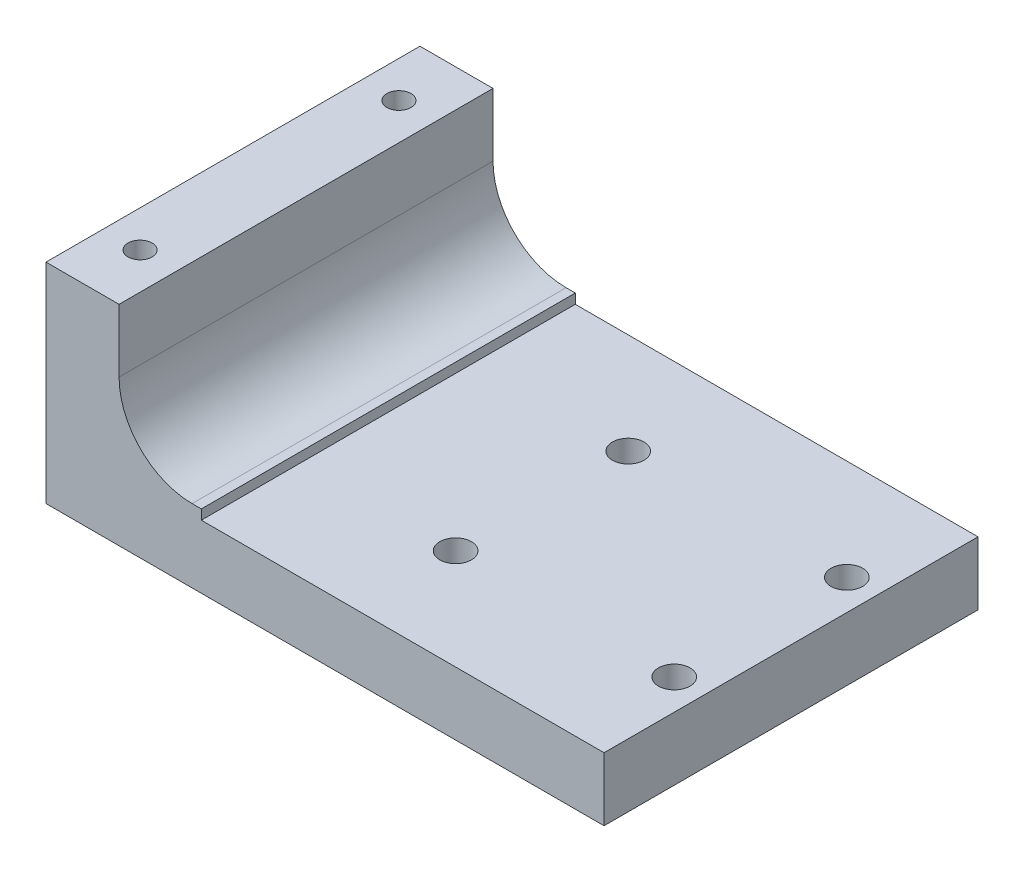
ISO-10303-21;
HEADER;
FILE_DESCRIPTION(('STEP AP214'),'2;1');
FILE_NAME('part.step','',(''),(''),'','','');
FILE_SCHEMA(('AUTOMOTIVE_DESIGN { 1 0 10303 214 1 1 1 1 }'));
ENDSEC;
DATA;
#1=APPLICATION_CONTEXT('core data for automotive mechanical design processes');
#2=APPLICATION_PROTOCOL_DEFINITION('international standard','automotive_design',2000,#1);
#3=PRODUCT_CONTEXT('',#1,'mechanical');
#4=PRODUCT('Part','Part','',(#3));
#5=PRODUCT_RELATED_PRODUCT_CATEGORY('part','',(#4));
#6=PRODUCT_DEFINITION_FORMATION('','',#4);
#7=PRODUCT_DEFINITION_CONTEXT('part definition',#1,'design');
#8=PRODUCT_DEFINITION('design','',#6,#7);
#9=PRODUCT_DEFINITION_SHAPE('','',#8);
#10=(LENGTH_UNIT() NAMED_UNIT(*) SI_UNIT(.MILLI.,.METRE.));
#11=(NAMED_UNIT(*) PLANE_ANGLE_UNIT() SI_UNIT($,.RADIAN.));
#12=(NAMED_UNIT(*) SI_UNIT($,.STERADIAN.) SOLID_ANGLE_UNIT());
#13=UNCERTAINTY_MEASURE_WITH_UNIT(LENGTH_MEASURE(1.E-05),#10,'distance_accuracy_value','');
#14=(GEOMETRIC_REPRESENTATION_CONTEXT(3) GLOBAL_UNCERTAINTY_ASSIGNED_CONTEXT((#13)) GLOBAL_UNIT_ASSIGNED_CONTEXT((#10,
#11,#12)) REPRESENTATION_CONTEXT('',''));
#15=CARTESIAN_POINT('',(0.,0.,0.));
#16=DIRECTION('',(0.,0.,1.));
#17=DIRECTION('',(1.,0.,0.));
#18=AXIS2_PLACEMENT_3D('',#15,#16,#17);
#19=CARTESIAN_POINT('',(0.,0.,32.5));
#20=DIRECTION('',(1.,0.,0.));
#21=DIRECTION('',(0.,0.,-1.));
#22=AXIS2_PLACEMENT_3D('',#19,#20,#21);
#23=PLANE('',#22);
#24=DIRECTION('',(0.,-1.,0.));
#25=VECTOR('',#24,1.);
#26=CARTESIAN_POINT('',(0.,0.,-32.5));
#27=LINE('',#26,#25);
#28=CARTESIAN_POINT('',(0.,36.35,-32.5));
#29=VERTEX_POINT('',#28);
#30=CARTESIAN_POINT('',(0.,0.,-32.5));
#31=VERTEX_POINT('',#30);
#32=EDGE_CURVE('E135',#29,#31,#27,.T.);
#33=ORIENTED_EDGE('',*,*,#32,.T.);
#34=DIRECTION('',(0.,0.,-1.));
#35=VECTOR('',#34,1.);
#36=CARTESIAN_POINT('',(0.,0.,32.5));
#37=LINE('',#36,#35);
#38=CARTESIAN_POINT('',(0.,0.,32.5));
#39=VERTEX_POINT('',#38);
#40=EDGE_CURVE('E11',#39,#31,#37,.T.);
#41=ORIENTED_EDGE('',*,*,#40,.F.);
#42=DIRECTION('',(0.,-1.,0.));
#43=VECTOR('',#42,1.);
#44=CARTESIAN_POINT('',(0.,0.,32.5));
#45=LINE('',#44,#43);
#46=CARTESIAN_POINT('',(0.,36.35,32.5));
#47=VERTEX_POINT('',#46);
#48=EDGE_CURVE('E150',#47,#39,#45,.T.);
#49=ORIENTED_EDGE('',*,*,#48,.F.);
#50=DIRECTION('',(0.,0.,-1.));
#51=VECTOR('',#50,1.);
#52=CARTESIAN_POINT('',(0.,36.35,32.5));
#53=LINE('',#52,#51);
#54=EDGE_CURVE('E131',#47,#29,#53,.T.);
#55=ORIENTED_EDGE('',*,*,#54,.T.);
#56=EDGE_LOOP('',(#33,#41,#49,#55));
#57=FACE_BOUND('',#56,.T.);
#58=ADVANCED_FACE('F37',(#57),#23,.F.);
#59=CARTESIAN_POINT('',(0.,0.,32.5));
#60=DIRECTION('',(0.,1.,0.));
#61=DIRECTION('',(0.,0.,1.));
#62=AXIS2_PLACEMENT_3D('',#59,#60,#61);
#63=PLANE('',#62);
#64=CARTESIAN_POINT('',(53.7000000000001,0.,15.));
#65=DIRECTION('',(0.,-1.,0.));
#66=DIRECTION('',(0.,0.,-1.));
#67=AXIS2_PLACEMENT_3D('',#64,#65,#66);
#68=CIRCLE('',#67,2.74999999999999);
#69=CARTESIAN_POINT('',(53.7000000000001,0.,12.25));
#70=VERTEX_POINT('',#69);
#71=EDGE_CURVE('E227',#70,#70,#68,.T.);
#72=ORIENTED_EDGE('',*,*,#71,.F.);
#73=EDGE_LOOP('',(#72));
#74=FACE_BOUND('',#73,.T.);
#75=CARTESIAN_POINT('',(91.7000000000001,0.,15.));
#76=DIRECTION('',(0.,-1.,0.));
#77=DIRECTION('',(0.,0.,-1.));
#78=AXIS2_PLACEMENT_3D('',#75,#76,#77);
#79=CIRCLE('',#78,2.74999999999999);
#80=CARTESIAN_POINT('',(91.7000000000001,0.,12.25));
#81=VERTEX_POINT('',#80);
#82=EDGE_CURVE('E230',#81,#81,#79,.T.);
#83=ORIENTED_EDGE('',*,*,#82,.F.);
#84=EDGE_LOOP('',(#83));
#85=FACE_BOUND('',#84,.T.);
#86=CARTESIAN_POINT('',(91.7000000000001,0.,-15.));
#87=DIRECTION('',(0.,-1.,0.));
#88=DIRECTION('',(0.,0.,-1.));
#89=AXIS2_PLACEMENT_3D('',#86,#87,#88);
#90=CIRCLE('',#89,2.74999999999999);
#91=CARTESIAN_POINT('',(91.7000000000001,0.,-17.75));
#92=VERTEX_POINT('',#91);
#93=EDGE_CURVE('E236',#92,#92,#90,.T.);
#94=ORIENTED_EDGE('',*,*,#93,.F.);
#95=EDGE_LOOP('',(#94));
#96=FACE_BOUND('',#95,.T.);
#97=CARTESIAN_POINT('',(53.7000000000001,0.,-15.));
#98=DIRECTION('',(0.,-1.,0.));
#99=DIRECTION('',(0.,0.,-1.));
#100=AXIS2_PLACEMENT_3D('',#97,#98,#99);
#101=CIRCLE('',#100,2.74999999999999);
#102=CARTESIAN_POINT('',(53.7000000000001,0.,-17.75));
#103=VERTEX_POINT('',#102);
#104=EDGE_CURVE('E176',#103,#103,#101,.T.);
#105=ORIENTED_EDGE('',*,*,#104,.F.);
#106=EDGE_LOOP('',(#105));
#107=FACE_BOUND('',#106,.T.);
#108=DIRECTION('',(1.,0.,0.));
#109=VECTOR('',#108,1.);
#110=CARTESIAN_POINT('',(0.,0.,-32.5));
#111=LINE('',#110,#109);
#112=CARTESIAN_POINT('',(97.,0.,-32.5));
#113=VERTEX_POINT('',#112);
#114=EDGE_CURVE('E138',#31,#113,#111,.T.);
#115=ORIENTED_EDGE('',*,*,#114,.T.);
#116=DIRECTION('',(0.,0.,-1.));
#117=VECTOR('',#116,1.);
#118=CARTESIAN_POINT('',(97.,0.,32.5));
#119=LINE('',#118,#117);
#120=CARTESIAN_POINT('',(97.,0.,32.5));
#121=VERTEX_POINT('',#120);
#122=EDGE_CURVE('E45',#121,#113,#119,.T.);
#123=ORIENTED_EDGE('',*,*,#122,.F.);
#124=DIRECTION('',(1.,0.,0.));
#125=VECTOR('',#124,1.);
#126=CARTESIAN_POINT('',(0.,0.,32.5));
#127=LINE('',#126,#125);
#128=EDGE_CURVE('E96',#39,#121,#127,.T.);
#129=ORIENTED_EDGE('',*,*,#128,.F.);
#130=ORIENTED_EDGE('',*,*,#40,.T.);
#131=EDGE_LOOP('',(#115,#123,#129,#130));
#132=FACE_BOUND('',#131,.T.);
#133=ADVANCED_FACE('F249',(#74,#85,#96,#107,#132),#63,.F.);
#134=CARTESIAN_POINT('',(97.,12.7,32.5));
#135=DIRECTION('',(-1.,0.,0.));
#136=DIRECTION('',(0.,0.,1.));
#137=AXIS2_PLACEMENT_3D('',#134,#135,#136);
#138=PLANE('',#137);
#139=DIRECTION('',(0.,1.,0.));
#140=VECTOR('',#139,1.);
#141=CARTESIAN_POINT('',(97.,12.7,-32.5));
#142=LINE('',#141,#140);
#143=CARTESIAN_POINT('',(97.,11.,-32.5));
#144=VERTEX_POINT('',#143);
#145=EDGE_CURVE('E141',#113,#144,#142,.T.);
#146=ORIENTED_EDGE('',*,*,#145,.T.);
#147=DIRECTION('',(0.,0.,-1.));
#148=VECTOR('',#147,1.);
#149=CARTESIAN_POINT('',(97.,11.,32.5));
#150=LINE('',#149,#148);
#151=CARTESIAN_POINT('',(97.,11.,32.5));
#152=VERTEX_POINT('',#151);
#153=EDGE_CURVE('E52',#152,#144,#150,.T.);
#154=ORIENTED_EDGE('',*,*,#153,.F.);
#155=DIRECTION('',(0.,1.,0.));
#156=VECTOR('',#155,1.);
#157=CARTESIAN_POINT('',(97.,12.7,32.5));
#158=LINE('',#157,#156);
#159=EDGE_CURVE('E160',#121,#152,#158,.T.);
#160=ORIENTED_EDGE('',*,*,#159,.F.);
#161=ORIENTED_EDGE('',*,*,#122,.T.);
#162=EDGE_LOOP('',(#146,#154,#160,#161));
#163=FACE_BOUND('',#162,.T.);
#164=ADVANCED_FACE('F158',(#163),#138,.F.);
#165=CARTESIAN_POINT('',(25.4,12.7,32.5));
#166=DIRECTION('',(0.,-1.,0.));
#167=DIRECTION('',(1.,0.,0.));
#168=AXIS2_PLACEMENT_3D('',#165,#166,#167);
#169=PLANE('',#168);
#170=DIRECTION('',(-1.,0.,0.));
#171=VECTOR('',#170,1.);
#172=CARTESIAN_POINT('',(25.4,12.7,32.5));
#173=LINE('',#172,#171);
#174=CARTESIAN_POINT('',(27.,12.7,32.5));
#175=VERTEX_POINT('',#174);
#176=CARTESIAN_POINT('',(25.4,12.7,32.5));
#177=VERTEX_POINT('',#176);
#178=EDGE_CURVE('E114',#175,#177,#173,.T.);
#179=ORIENTED_EDGE('',*,*,#178,.F.);
#180=DIRECTION('',(0.,0.,-1.));
#181=VECTOR('',#180,1.);
#182=CARTESIAN_POINT('',(27.,12.7,32.5));
#183=LINE('',#182,#181);
#184=CARTESIAN_POINT('',(27.,12.7,-32.5));
#185=VERTEX_POINT('',#184);
#186=EDGE_CURVE('E139',#175,#185,#183,.T.);
#187=ORIENTED_EDGE('',*,*,#186,.T.);
#188=DIRECTION('',(-1.,0.,0.));
#189=VECTOR('',#188,1.);
#190=CARTESIAN_POINT('',(25.4,12.7,-32.5));
#191=LINE('',#190,#189);
#192=CARTESIAN_POINT('',(25.4,12.7,-32.5));
#193=VERTEX_POINT('',#192);
#194=EDGE_CURVE('E144',#185,#193,#191,.T.);
#195=ORIENTED_EDGE('',*,*,#194,.T.);
#196=DIRECTION('',(0.,0.,-1.));
#197=VECTOR('',#196,1.);
#198=CARTESIAN_POINT('',(25.4,12.7,32.5));
#199=LINE('',#198,#197);
#200=EDGE_CURVE('E126',#177,#193,#199,.T.);
#201=ORIENTED_EDGE('',*,*,#200,.F.);
#202=EDGE_LOOP('',(#179,#187,#195,#201));
#203=FACE_BOUND('',#202,.T.);
#204=ADVANCED_FACE('F244',(#203),#169,.F.);
#205=CARTESIAN_POINT('',(25.4,25.4,32.5));
#206=DIRECTION('',(0.,0.,-1.));
#207=DIRECTION('',(-1.,0.,0.));
#208=AXIS2_PLACEMENT_3D('',#205,#206,#207);
#209=CYLINDRICAL_SURFACE('',#208,12.7);
#210=CARTESIAN_POINT('',(25.4,25.4,-32.5));
#211=DIRECTION('',(0.,0.,-1.));
#212=DIRECTION('',(1.,0.,0.));
#213=AXIS2_PLACEMENT_3D('',#210,#211,#212);
#214=CIRCLE('',#213,12.7);
#215=CARTESIAN_POINT('',(12.7,25.4,-32.5));
#216=VERTEX_POINT('',#215);
#217=EDGE_CURVE('E123',#193,#216,#214,.T.);
#218=ORIENTED_EDGE('',*,*,#217,.T.);
#219=DIRECTION('',(0.,0.,-1.));
#220=VECTOR('',#219,1.);
#221=CARTESIAN_POINT('',(12.7,25.4,32.5));
#222=LINE('',#221,#220);
#223=CARTESIAN_POINT('',(12.7,25.4,32.5));
#224=VERTEX_POINT('',#223);
#225=EDGE_CURVE('E120',#224,#216,#222,.T.);
#226=ORIENTED_EDGE('',*,*,#225,.F.);
#227=CARTESIAN_POINT('',(25.4,25.4,32.5));
#228=DIRECTION('',(0.,0.,-1.));
#229=DIRECTION('',(1.,0.,0.));
#230=AXIS2_PLACEMENT_3D('',#227,#228,#229);
#231=CIRCLE('',#230,12.7);
#232=EDGE_CURVE('E106',#177,#224,#231,.T.);
#233=ORIENTED_EDGE('',*,*,#232,.F.);
#234=ORIENTED_EDGE('',*,*,#200,.T.);
#235=EDGE_LOOP('',(#218,#226,#233,#234));
#236=FACE_BOUND('',#235,.T.);
#237=ADVANCED_FACE('F121',(#236),#209,.F.);
#238=CARTESIAN_POINT('',(12.7,36.35,32.5));
#239=DIRECTION('',(-1.,0.,0.));
#240=DIRECTION('',(0.,-1.,0.));
#241=AXIS2_PLACEMENT_3D('',#238,#239,#240);
#242=PLANE('',#241);
#243=DIRECTION('',(0.,1.,0.));
#244=VECTOR('',#243,1.);
#245=CARTESIAN_POINT('',(12.7,36.35,-32.5));
#246=LINE('',#245,#244);
#247=CARTESIAN_POINT('',(12.7,36.35,-32.5));
#248=VERTEX_POINT('',#247);
#249=EDGE_CURVE('E147',#216,#248,#246,.T.);
#250=ORIENTED_EDGE('',*,*,#249,.T.);
#251=DIRECTION('',(0.,0.,-1.));
#252=VECTOR('',#251,1.);
#253=CARTESIAN_POINT('',(12.7,36.35,32.5));
#254=LINE('',#253,#252);
#255=CARTESIAN_POINT('',(12.7,36.35,32.5));
#256=VERTEX_POINT('',#255);
#257=EDGE_CURVE('E127',#256,#248,#254,.T.);
#258=ORIENTED_EDGE('',*,*,#257,.F.);
#259=DIRECTION('',(0.,1.,0.));
#260=VECTOR('',#259,1.);
#261=CARTESIAN_POINT('',(12.7,36.35,32.5));
#262=LINE('',#261,#260);
#263=EDGE_CURVE('E111',#224,#256,#262,.T.);
#264=ORIENTED_EDGE('',*,*,#263,.F.);
#265=ORIENTED_EDGE('',*,*,#225,.T.);
#266=EDGE_LOOP('',(#250,#258,#264,#265));
#267=FACE_BOUND('',#266,.T.);
#268=ADVANCED_FACE('F129',(#267),#242,.F.);
#269=CARTESIAN_POINT('',(0.,36.35,32.5));
#270=DIRECTION('',(0.,-1.,0.));
#271=DIRECTION('',(1.,0.,0.));
#272=AXIS2_PLACEMENT_3D('',#269,#270,#271);
#273=PLANE('',#272);
#274=CARTESIAN_POINT('',(6.35000000000001,36.35,22.5));
#275=DIRECTION('',(0.,1.,0.));
#276=DIRECTION('',(0.,0.,1.));
#277=AXIS2_PLACEMENT_3D('',#274,#275,#276);
#278=CIRCLE('',#277,2.09999999999999);
#279=CARTESIAN_POINT('',(6.35000000000001,36.35,24.6));
#280=VERTEX_POINT('',#279);
#281=EDGE_CURVE('E216',#280,#280,#278,.T.);
#282=ORIENTED_EDGE('',*,*,#281,.F.);
#283=EDGE_LOOP('',(#282));
#284=FACE_BOUND('',#283,.T.);
#285=CARTESIAN_POINT('',(6.35000000000001,36.35,-22.5));
#286=DIRECTION('',(0.,1.,0.));
#287=DIRECTION('',(0.,0.,1.));
#288=AXIS2_PLACEMENT_3D('',#285,#286,#287);
#289=CIRCLE('',#288,2.09999999999999);
#290=CARTESIAN_POINT('',(6.35000000000001,36.35,-20.4));
#291=VERTEX_POINT('',#290);
#292=EDGE_CURVE('E224',#291,#291,#289,.T.);
#293=ORIENTED_EDGE('',*,*,#292,.F.);
#294=EDGE_LOOP('',(#293));
#295=FACE_BOUND('',#294,.T.);
#296=DIRECTION('',(-1.,0.,0.));
#297=VECTOR('',#296,1.);
#298=CARTESIAN_POINT('',(0.,36.35,-32.5));
#299=LINE('',#298,#297);
#300=EDGE_CURVE('E88',#248,#29,#299,.T.);
#301=ORIENTED_EDGE('',*,*,#300,.T.);
#302=ORIENTED_EDGE('',*,*,#54,.F.);
#303=DIRECTION('',(-1.,0.,0.));
#304=VECTOR('',#303,1.);
#305=CARTESIAN_POINT('',(0.,36.35,32.5));
#306=LINE('',#305,#304);
#307=EDGE_CURVE('E61',#256,#47,#306,.T.);
#308=ORIENTED_EDGE('',*,*,#307,.F.);
#309=ORIENTED_EDGE('',*,*,#257,.T.);
#310=EDGE_LOOP('',(#301,#302,#308,#309));
#311=FACE_BOUND('',#310,.T.);
#312=ADVANCED_FACE('F245',(#284,#295,#311),#273,.F.);
#313=CARTESIAN_POINT('',(25.4,25.4,32.5));
#314=DIRECTION('',(0.,0.,1.));
#315=DIRECTION('',(1.,0.,0.));
#316=AXIS2_PLACEMENT_3D('',#313,#314,#315);
#317=PLANE('',#316);
#318=DIRECTION('',(0.,1.,0.));
#319=VECTOR('',#318,1.);
#320=CARTESIAN_POINT('',(27.,12.7,32.5));
#321=LINE('',#320,#319);
#322=CARTESIAN_POINT('',(27.,11.,32.5));
#323=VERTEX_POINT('',#322);
#324=EDGE_CURVE('E179',#323,#175,#321,.T.);
#325=ORIENTED_EDGE('',*,*,#324,.T.);
#326=ORIENTED_EDGE('',*,*,#178,.T.);
#327=ORIENTED_EDGE('',*,*,#232,.T.);
#328=ORIENTED_EDGE('',*,*,#263,.T.);
#329=ORIENTED_EDGE('',*,*,#307,.T.);
#330=ORIENTED_EDGE('',*,*,#48,.T.);
#331=ORIENTED_EDGE('',*,*,#128,.T.);
#332=ORIENTED_EDGE('',*,*,#159,.T.);
#333=DIRECTION('',(-1.,0.,0.));
#334=VECTOR('',#333,1.);
#335=CARTESIAN_POINT('',(97.,11.,32.5));
#336=LINE('',#335,#334);
#337=EDGE_CURVE('E173',#152,#323,#336,.T.);
#338=ORIENTED_EDGE('',*,*,#337,.T.);
#339=EDGE_LOOP('',(#325,#326,#327,#328,#329,#330,#331,#332,#338));
#340=FACE_BOUND('',#339,.T.);
#341=ADVANCED_FACE('F109',(#340),#317,.T.);
#342=CARTESIAN_POINT('',(25.4,25.4,-32.5));
#343=DIRECTION('',(0.,0.,1.));
#344=DIRECTION('',(1.,0.,0.));
#345=AXIS2_PLACEMENT_3D('',#342,#343,#344);
#346=PLANE('',#345);
#347=ORIENTED_EDGE('',*,*,#194,.F.);
#348=DIRECTION('',(0.,1.,0.));
#349=VECTOR('',#348,1.);
#350=CARTESIAN_POINT('',(27.,12.7,-32.5));
#351=LINE('',#350,#349);
#352=CARTESIAN_POINT('',(27.,11.,-32.5));
#353=VERTEX_POINT('',#352);
#354=EDGE_CURVE('E169',#353,#185,#351,.T.);
#355=ORIENTED_EDGE('',*,*,#354,.F.);
#356=DIRECTION('',(-1.,0.,0.));
#357=VECTOR('',#356,1.);
#358=CARTESIAN_POINT('',(97.,11.,-32.5));
#359=LINE('',#358,#357);
#360=EDGE_CURVE('E166',#144,#353,#359,.T.);
#361=ORIENTED_EDGE('',*,*,#360,.F.);
#362=ORIENTED_EDGE('',*,*,#145,.F.);
#363=ORIENTED_EDGE('',*,*,#114,.F.);
#364=ORIENTED_EDGE('',*,*,#32,.F.);
#365=ORIENTED_EDGE('',*,*,#300,.F.);
#366=ORIENTED_EDGE('',*,*,#249,.F.);
#367=ORIENTED_EDGE('',*,*,#217,.F.);
#368=EDGE_LOOP('',(#347,#355,#361,#362,#363,#364,#365,#366,#367));
#369=FACE_BOUND('',#368,.T.);
#370=ADVANCED_FACE('F163',(#369),#346,.F.);
#371=CARTESIAN_POINT('',(27.,12.7,32.5));
#372=DIRECTION('',(-1.,0.,0.));
#373=DIRECTION('',(0.,0.,1.));
#374=AXIS2_PLACEMENT_3D('',#371,#372,#373);
#375=PLANE('',#374);
#376=ORIENTED_EDGE('',*,*,#354,.T.);
#377=ORIENTED_EDGE('',*,*,#186,.F.);
#378=ORIENTED_EDGE('',*,*,#324,.F.);
#379=DIRECTION('',(0.,0.,-1.));
#380=VECTOR('',#379,1.);
#381=CARTESIAN_POINT('',(27.,11.,32.5));
#382=LINE('',#381,#380);
#383=EDGE_CURVE('E184',#323,#353,#382,.T.);
#384=ORIENTED_EDGE('',*,*,#383,.T.);
#385=EDGE_LOOP('',(#376,#377,#378,#384));
#386=FACE_BOUND('',#385,.T.);
#387=ADVANCED_FACE('F271',(#386),#375,.F.);
#388=CARTESIAN_POINT('',(97.,11.,32.5));
#389=DIRECTION('',(0.,-1.,0.));
#390=DIRECTION('',(0.,0.,-1.));
#391=AXIS2_PLACEMENT_3D('',#388,#389,#390);
#392=PLANE('',#391);
#393=CARTESIAN_POINT('',(53.7000000000001,11.,15.));
#394=DIRECTION('',(0.,-1.,0.));
#395=DIRECTION('',(0.,0.,-1.));
#396=AXIS2_PLACEMENT_3D('',#393,#394,#395);
#397=CIRCLE('',#396,2.74999999999999);
#398=CARTESIAN_POINT('',(53.7000000000001,11.,12.25));
#399=VERTEX_POINT('',#398);
#400=EDGE_CURVE('E40',#399,#399,#397,.T.);
#401=ORIENTED_EDGE('',*,*,#400,.T.);
#402=EDGE_LOOP('',(#401));
#403=FACE_BOUND('',#402,.T.);
#404=CARTESIAN_POINT('',(91.7000000000001,11.,15.));
#405=DIRECTION('',(0.,-1.,0.));
#406=DIRECTION('',(0.,0.,-1.));
#407=AXIS2_PLACEMENT_3D('',#404,#405,#406);
#408=CIRCLE('',#407,2.74999999999999);
#409=CARTESIAN_POINT('',(91.7000000000001,11.,12.25));
#410=VERTEX_POINT('',#409);
#411=EDGE_CURVE('E233',#410,#410,#408,.T.);
#412=ORIENTED_EDGE('',*,*,#411,.T.);
#413=EDGE_LOOP('',(#412));
#414=FACE_BOUND('',#413,.T.);
#415=CARTESIAN_POINT('',(91.7000000000001,11.,-15.));
#416=DIRECTION('',(0.,-1.,0.));
#417=DIRECTION('',(0.,0.,-1.));
#418=AXIS2_PLACEMENT_3D('',#415,#416,#417);
#419=CIRCLE('',#418,2.74999999999999);
#420=CARTESIAN_POINT('',(91.7000000000001,11.,-17.75));
#421=VERTEX_POINT('',#420);
#422=EDGE_CURVE('E239',#421,#421,#419,.T.);
#423=ORIENTED_EDGE('',*,*,#422,.T.);
#424=EDGE_LOOP('',(#423));
#425=FACE_BOUND('',#424,.T.);
#426=CARTESIAN_POINT('',(53.7000000000001,11.,-15.));
#427=DIRECTION('',(0.,-1.,0.));
#428=DIRECTION('',(0.,0.,-1.));
#429=AXIS2_PLACEMENT_3D('',#426,#427,#428);
#430=CIRCLE('',#429,2.74999999999999);
#431=CARTESIAN_POINT('',(53.7000000000001,11.,-17.75));
#432=VERTEX_POINT('',#431);
#433=EDGE_CURVE('E171',#432,#432,#430,.T.);
#434=ORIENTED_EDGE('',*,*,#433,.T.);
#435=EDGE_LOOP('',(#434));
#436=FACE_BOUND('',#435,.T.);
#437=ORIENTED_EDGE('',*,*,#360,.T.);
#438=ORIENTED_EDGE('',*,*,#383,.F.);
#439=ORIENTED_EDGE('',*,*,#337,.F.);
#440=ORIENTED_EDGE('',*,*,#153,.T.);
#441=EDGE_LOOP('',(#437,#438,#439,#440));
#442=FACE_BOUND('',#441,.T.);
#443=ADVANCED_FACE('F274',(#403,#414,#425,#436,#442),#392,.F.);
#444=CARTESIAN_POINT('',(53.7000000000001,0.,-15.));
#445=DIRECTION('',(0.,-1.,0.));
#446=DIRECTION('',(0.,0.,-1.));
#447=AXIS2_PLACEMENT_3D('',#444,#445,#446);
#448=CYLINDRICAL_SURFACE('',#447,2.74999999999999);
#449=ORIENTED_EDGE('',*,*,#104,.T.);
#450=EDGE_LOOP('',(#449));
#451=FACE_BOUND('',#450,.T.);
#452=ORIENTED_EDGE('',*,*,#433,.F.);
#453=EDGE_LOOP('',(#452));
#454=FACE_BOUND('',#453,.T.);
#455=ADVANCED_FACE('F277',(#451,#454),#448,.F.);
#456=CARTESIAN_POINT('',(91.7000000000001,0.,-15.));
#457=DIRECTION('',(0.,-1.,0.));
#458=DIRECTION('',(0.,0.,-1.));
#459=AXIS2_PLACEMENT_3D('',#456,#457,#458);
#460=CYLINDRICAL_SURFACE('',#459,2.74999999999999);
#461=ORIENTED_EDGE('',*,*,#93,.T.);
#462=EDGE_LOOP('',(#461));
#463=FACE_BOUND('',#462,.T.);
#464=ORIENTED_EDGE('',*,*,#422,.F.);
#465=EDGE_LOOP('',(#464));
#466=FACE_BOUND('',#465,.T.);
#467=ADVANCED_FACE('F283',(#463,#466),#460,.F.);
#468=CARTESIAN_POINT('',(91.7000000000001,0.,15.));
#469=DIRECTION('',(0.,-1.,0.));
#470=DIRECTION('',(0.,0.,-1.));
#471=AXIS2_PLACEMENT_3D('',#468,#469,#470);
#472=CYLINDRICAL_SURFACE('',#471,2.74999999999999);
#473=ORIENTED_EDGE('',*,*,#82,.T.);
#474=EDGE_LOOP('',(#473));
#475=FACE_BOUND('',#474,.T.);
#476=ORIENTED_EDGE('',*,*,#411,.F.);
#477=EDGE_LOOP('',(#476));
#478=FACE_BOUND('',#477,.T.);
#479=ADVANCED_FACE('F287',(#475,#478),#472,.F.);
#480=CARTESIAN_POINT('',(53.7000000000001,0.,15.));
#481=DIRECTION('',(0.,-1.,0.));
#482=DIRECTION('',(0.,0.,-1.));
#483=AXIS2_PLACEMENT_3D('',#480,#481,#482);
#484=CYLINDRICAL_SURFACE('',#483,2.74999999999999);
#485=ORIENTED_EDGE('',*,*,#71,.T.);
#486=EDGE_LOOP('',(#485));
#487=FACE_BOUND('',#486,.T.);
#488=ORIENTED_EDGE('',*,*,#400,.F.);
#489=EDGE_LOOP('',(#488));
#490=FACE_BOUND('',#489,.T.);
#491=ADVANCED_FACE('F291',(#487,#490),#484,.F.);
#492=CARTESIAN_POINT('',(6.35000000000001,36.35,-22.5));
#493=DIRECTION('',(0.,1.,0.));
#494=DIRECTION('',(0.,0.,1.));
#495=AXIS2_PLACEMENT_3D('',#492,#493,#494);
#496=CYLINDRICAL_SURFACE('',#495,2.09999999999999);
#497=CARTESIAN_POINT('',(6.35000000000001,17.3,-22.5));
#498=DIRECTION('',(0.,1.,0.));
#499=DIRECTION('',(0.,0.,1.));
#500=AXIS2_PLACEMENT_3D('',#497,#498,#499);
#501=CIRCLE('',#500,2.09999999999999);
#502=CARTESIAN_POINT('',(6.35000000000001,17.3,-20.4));
#503=VERTEX_POINT('',#502);
#504=EDGE_CURVE('E219',#503,#503,#501,.T.);
#505=ORIENTED_EDGE('',*,*,#504,.F.);
#506=EDGE_LOOP('',(#505));
#507=FACE_BOUND('',#506,.T.);
#508=ORIENTED_EDGE('',*,*,#292,.T.);
#509=EDGE_LOOP('',(#508));
#510=FACE_BOUND('',#509,.T.);
#511=ADVANCED_FACE('F295',(#507,#510),#496,.F.);
#512=CARTESIAN_POINT('',(6.35000000000001,17.3,-22.5));
#513=DIRECTION('',(0.,1.,0.));
#514=DIRECTION('',(0.,0.,1.));
#515=AXIS2_PLACEMENT_3D('',#512,#513,#514);
#516=CONICAL_SURFACE('',#515,2.09999999999999,1.02974425867665);
#517=CARTESIAN_POINT('',(6.35,16.0381927000421,-22.5));
#518=VERTEX_POINT('',#517);
#519=VERTEX_LOOP('',#518);
#520=FACE_BOUND('',#519,.T.);
#521=ORIENTED_EDGE('',*,*,#504,.T.);
#522=EDGE_LOOP('',(#521));
#523=FACE_BOUND('',#522,.T.);
#524=ADVANCED_FACE('F299',(#520,#523),#516,.F.);
#525=CARTESIAN_POINT('',(6.35000000000001,36.35,22.5));
#526=DIRECTION('',(0.,1.,0.));
#527=DIRECTION('',(0.,0.,1.));
#528=AXIS2_PLACEMENT_3D('',#525,#526,#527);
#529=CYLINDRICAL_SURFACE('',#528,2.09999999999999);
#530=CARTESIAN_POINT('',(6.35000000000001,17.3,22.5));
#531=DIRECTION('',(0.,1.,0.));
#532=DIRECTION('',(0.,0.,1.));
#533=AXIS2_PLACEMENT_3D('',#530,#531,#532);
#534=CIRCLE('',#533,2.09999999999999);
#535=CARTESIAN_POINT('',(6.35000000000001,17.3,24.6));
#536=VERTEX_POINT('',#535);
#537=EDGE_CURVE('E214',#536,#536,#534,.T.);
#538=ORIENTED_EDGE('',*,*,#537,.F.);
#539=EDGE_LOOP('',(#538));
#540=FACE_BOUND('',#539,.T.);
#541=ORIENTED_EDGE('',*,*,#281,.T.);
#542=EDGE_LOOP('',(#541));
#543=FACE_BOUND('',#542,.T.);
#544=ADVANCED_FACE('F210',(#540,#543),#529,.F.);
#545=CARTESIAN_POINT('',(6.35000000000001,17.3,22.5));
#546=DIRECTION('',(0.,1.,0.));
#547=DIRECTION('',(0.,0.,1.));
#548=AXIS2_PLACEMENT_3D('',#545,#546,#547);
#549=CONICAL_SURFACE('',#548,2.09999999999999,1.02974425867665);
#550=CARTESIAN_POINT('',(6.35000000000001,16.0381927000421,22.5));
#551=VERTEX_POINT('',#550);
#552=VERTEX_LOOP('',#551);
#553=FACE_BOUND('',#552,.T.);
#554=ORIENTED_EDGE('',*,*,#537,.T.);
#555=EDGE_LOOP('',(#554));
#556=FACE_BOUND('',#555,.T.);
#557=ADVANCED_FACE('F207',(#553,#556),#549,.F.);
#558=CLOSED_SHELL('',(#58,#133,#164,#204,#237,#268,#312,#341,#370,#387,#443,#455,#467,#479,#491,
#511,#524,#544,#557));
#559=MANIFOLD_SOLID_BREP('B2',#558);
#560=ADVANCED_BREP_SHAPE_REPRESENTATION('',(#18,#559),#14);
#561=SHAPE_DEFINITION_REPRESENTATION(#9,#560);
ENDSEC;
END-ISO-10303-21;
